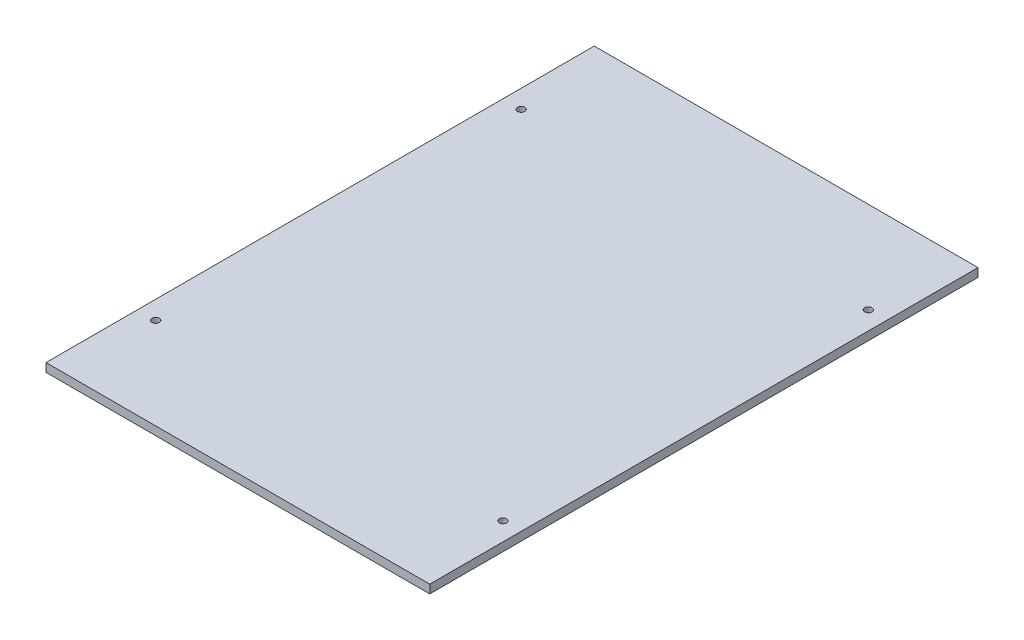
ISO-10303-21;
HEADER;
FILE_DESCRIPTION(('STEP AP214'),'2;1');
FILE_NAME('part.step','',(''),(''),'','','');
FILE_SCHEMA(('AUTOMOTIVE_DESIGN { 1 0 10303 214 1 1 1 1 }'));
ENDSEC;
DATA;
#1=APPLICATION_CONTEXT('core data for automotive mechanical design processes');
#2=APPLICATION_PROTOCOL_DEFINITION('international standard','automotive_design',2000,#1);
#3=PRODUCT_CONTEXT('',#1,'mechanical');
#4=PRODUCT('Part','Part','',(#3));
#5=PRODUCT_RELATED_PRODUCT_CATEGORY('part','',(#4));
#6=PRODUCT_DEFINITION_FORMATION('','',#4);
#7=PRODUCT_DEFINITION_CONTEXT('part definition',#1,'design');
#8=PRODUCT_DEFINITION('design','',#6,#7);
#9=PRODUCT_DEFINITION_SHAPE('','',#8);
#10=(LENGTH_UNIT() NAMED_UNIT(*) SI_UNIT(.MILLI.,.METRE.));
#11=(NAMED_UNIT(*) PLANE_ANGLE_UNIT() SI_UNIT($,.RADIAN.));
#12=(NAMED_UNIT(*) SI_UNIT($,.STERADIAN.) SOLID_ANGLE_UNIT());
#13=UNCERTAINTY_MEASURE_WITH_UNIT(LENGTH_MEASURE(1.E-05),#10,'distance_accuracy_value','');
#14=(GEOMETRIC_REPRESENTATION_CONTEXT(3) GLOBAL_UNCERTAINTY_ASSIGNED_CONTEXT((#13)) GLOBAL_UNIT_ASSIGNED_CONTEXT((#10,
#11,#12)) REPRESENTATION_CONTEXT('',''));
#15=CARTESIAN_POINT('',(0.,0.,0.));
#16=DIRECTION('',(0.,0.,1.));
#17=DIRECTION('',(1.,0.,0.));
#18=AXIS2_PLACEMENT_3D('',#15,#16,#17);
#19=CARTESIAN_POINT('',(0.,4.65,0.));
#20=DIRECTION('',(1.,0.,0.));
#21=DIRECTION('',(0.,0.,-1.));
#22=AXIS2_PLACEMENT_3D('',#19,#20,#21);
#23=PLANE('',#22);
#24=DIRECTION('',(0.,0.,1.));
#25=VECTOR('',#24,1.);
#26=CARTESIAN_POINT('',(0.,0.,0.));
#27=LINE('',#26,#25);
#28=CARTESIAN_POINT('',(0.,0.,-300.));
#29=VERTEX_POINT('',#28);
#30=CARTESIAN_POINT('',(0.,0.,0.));
#31=VERTEX_POINT('',#30);
#32=EDGE_CURVE('E96',#29,#31,#27,.T.);
#33=ORIENTED_EDGE('',*,*,#32,.T.);
#34=DIRECTION('',(0.,-1.,0.));
#35=VECTOR('',#34,1.);
#36=CARTESIAN_POINT('',(0.,4.65,0.));
#37=LINE('',#36,#35);
#38=CARTESIAN_POINT('',(0.,4.65,0.));
#39=VERTEX_POINT('',#38);
#40=EDGE_CURVE('E11',#39,#31,#37,.T.);
#41=ORIENTED_EDGE('',*,*,#40,.F.);
#42=DIRECTION('',(0.,0.,1.));
#43=VECTOR('',#42,1.);
#44=CARTESIAN_POINT('',(0.,4.65,0.));
#45=LINE('',#44,#43);
#46=CARTESIAN_POINT('',(0.,4.65,-300.));
#47=VERTEX_POINT('',#46);
#48=EDGE_CURVE('E84',#47,#39,#45,.T.);
#49=ORIENTED_EDGE('',*,*,#48,.F.);
#50=DIRECTION('',(0.,-1.,0.));
#51=VECTOR('',#50,1.);
#52=CARTESIAN_POINT('',(0.,4.65,-300.));
#53=LINE('',#52,#51);
#54=EDGE_CURVE('E92',#47,#29,#53,.T.);
#55=ORIENTED_EDGE('',*,*,#54,.T.);
#56=EDGE_LOOP('',(#33,#41,#49,#55));
#57=FACE_BOUND('',#56,.T.);
#58=ADVANCED_FACE('F33',(#57),#23,.F.);
#59=CARTESIAN_POINT('',(0.,4.65,0.));
#60=DIRECTION('',(0.,0.,-1.));
#61=DIRECTION('',(-1.,0.,0.));
#62=AXIS2_PLACEMENT_3D('',#59,#60,#61);
#63=PLANE('',#62);
#64=DIRECTION('',(1.,0.,0.));
#65=VECTOR('',#64,1.);
#66=CARTESIAN_POINT('',(0.,0.,0.));
#67=LINE('',#66,#65);
#68=CARTESIAN_POINT('',(210.,0.,0.));
#69=VERTEX_POINT('',#68);
#70=EDGE_CURVE('E88',#31,#69,#67,.T.);
#71=ORIENTED_EDGE('',*,*,#70,.T.);
#72=DIRECTION('',(0.,-1.,0.));
#73=VECTOR('',#72,1.);
#74=CARTESIAN_POINT('',(210.,4.65,0.));
#75=LINE('',#74,#73);
#76=CARTESIAN_POINT('',(210.,4.65,0.));
#77=VERTEX_POINT('',#76);
#78=EDGE_CURVE('E41',#77,#69,#75,.T.);
#79=ORIENTED_EDGE('',*,*,#78,.F.);
#80=DIRECTION('',(1.,0.,0.));
#81=VECTOR('',#80,1.);
#82=CARTESIAN_POINT('',(0.,4.65,0.));
#83=LINE('',#82,#81);
#84=EDGE_CURVE('E79',#39,#77,#83,.T.);
#85=ORIENTED_EDGE('',*,*,#84,.F.);
#86=ORIENTED_EDGE('',*,*,#40,.T.);
#87=EDGE_LOOP('',(#71,#79,#85,#86));
#88=FACE_BOUND('',#87,.T.);
#89=ADVANCED_FACE('F87',(#88),#63,.F.);
#90=CARTESIAN_POINT('',(210.,4.65,0.));
#91=DIRECTION('',(-1.,0.,0.));
#92=DIRECTION('',(0.,0.,1.));
#93=AXIS2_PLACEMENT_3D('',#90,#91,#92);
#94=PLANE('',#93);
#95=DIRECTION('',(0.,0.,-1.));
#96=VECTOR('',#95,1.);
#97=CARTESIAN_POINT('',(210.,0.,0.));
#98=LINE('',#97,#96);
#99=CARTESIAN_POINT('',(210.,0.,-300.));
#100=VERTEX_POINT('',#99);
#101=EDGE_CURVE('E66',#69,#100,#98,.T.);
#102=ORIENTED_EDGE('',*,*,#101,.T.);
#103=DIRECTION('',(0.,-1.,0.));
#104=VECTOR('',#103,1.);
#105=CARTESIAN_POINT('',(210.,4.65,-300.));
#106=LINE('',#105,#104);
#107=CARTESIAN_POINT('',(210.,4.65,-300.));
#108=VERTEX_POINT('',#107);
#109=EDGE_CURVE('E89',#108,#100,#106,.T.);
#110=ORIENTED_EDGE('',*,*,#109,.F.);
#111=DIRECTION('',(0.,0.,-1.));
#112=VECTOR('',#111,1.);
#113=CARTESIAN_POINT('',(210.,4.65,0.));
#114=LINE('',#113,#112);
#115=EDGE_CURVE('E82',#77,#108,#114,.T.);
#116=ORIENTED_EDGE('',*,*,#115,.F.);
#117=ORIENTED_EDGE('',*,*,#78,.T.);
#118=EDGE_LOOP('',(#102,#110,#116,#117));
#119=FACE_BOUND('',#118,.T.);
#120=ADVANCED_FACE('F90',(#119),#94,.F.);
#121=CARTESIAN_POINT('',(0.,4.65,-300.));
#122=DIRECTION('',(0.,0.,1.));
#123=DIRECTION('',(1.,0.,0.));
#124=AXIS2_PLACEMENT_3D('',#121,#122,#123);
#125=PLANE('',#124);
#126=DIRECTION('',(-1.,0.,0.));
#127=VECTOR('',#126,1.);
#128=CARTESIAN_POINT('',(0.,0.,-300.));
#129=LINE('',#128,#127);
#130=EDGE_CURVE('E72',#100,#29,#129,.T.);
#131=ORIENTED_EDGE('',*,*,#130,.T.);
#132=ORIENTED_EDGE('',*,*,#54,.F.);
#133=DIRECTION('',(-1.,0.,0.));
#134=VECTOR('',#133,1.);
#135=CARTESIAN_POINT('',(0.,4.65,-300.));
#136=LINE('',#135,#134);
#137=EDGE_CURVE('E49',#108,#47,#136,.T.);
#138=ORIENTED_EDGE('',*,*,#137,.F.);
#139=ORIENTED_EDGE('',*,*,#109,.T.);
#140=EDGE_LOOP('',(#131,#132,#138,#139));
#141=FACE_BOUND('',#140,.T.);
#142=ADVANCED_FACE('F104',(#141),#125,.F.);
#143=CARTESIAN_POINT('',(0.,4.65,0.));
#144=DIRECTION('',(0.,-1.,0.));
#145=DIRECTION('',(0.,0.,-1.));
#146=AXIS2_PLACEMENT_3D('',#143,#144,#145);
#147=PLANE('',#146);
#148=CARTESIAN_POINT('',(10.,4.65,-250.));
#149=DIRECTION('',(0.,1.,0.));
#150=DIRECTION('',(0.,0.,1.));
#151=AXIS2_PLACEMENT_3D('',#148,#149,#150);
#152=CIRCLE('',#151,1.99999999999999);
#153=CARTESIAN_POINT('',(10.,4.65,-248.));
#154=VERTEX_POINT('',#153);
#155=EDGE_CURVE('E130',#154,#154,#152,.T.);
#156=ORIENTED_EDGE('',*,*,#155,.F.);
#157=EDGE_LOOP('',(#156));
#158=FACE_BOUND('',#157,.T.);
#159=CARTESIAN_POINT('',(10.,4.65,-50.));
#160=DIRECTION('',(0.,1.,0.));
#161=DIRECTION('',(0.,0.,1.));
#162=AXIS2_PLACEMENT_3D('',#159,#160,#161);
#163=CIRCLE('',#162,1.99999999999999);
#164=CARTESIAN_POINT('',(10.,4.65,-48.));
#165=VERTEX_POINT('',#164);
#166=EDGE_CURVE('E124',#165,#165,#163,.T.);
#167=ORIENTED_EDGE('',*,*,#166,.F.);
#168=EDGE_LOOP('',(#167));
#169=FACE_BOUND('',#168,.T.);
#170=CARTESIAN_POINT('',(200.,4.65,-250.));
#171=DIRECTION('',(0.,1.,0.));
#172=DIRECTION('',(0.,0.,1.));
#173=AXIS2_PLACEMENT_3D('',#170,#171,#172);
#174=CIRCLE('',#173,1.99999999999997);
#175=CARTESIAN_POINT('',(200.,4.65,-248.));
#176=VERTEX_POINT('',#175);
#177=EDGE_CURVE('E118',#176,#176,#174,.T.);
#178=ORIENTED_EDGE('',*,*,#177,.F.);
#179=EDGE_LOOP('',(#178));
#180=FACE_BOUND('',#179,.T.);
#181=CARTESIAN_POINT('',(200.,4.65,-50.));
#182=DIRECTION('',(0.,1.,0.));
#183=DIRECTION('',(0.,0.,1.));
#184=AXIS2_PLACEMENT_3D('',#181,#182,#183);
#185=CIRCLE('',#184,1.99999999999997);
#186=CARTESIAN_POINT('',(200.,4.65,-48.));
#187=VERTEX_POINT('',#186);
#188=EDGE_CURVE('E112',#187,#187,#185,.T.);
#189=ORIENTED_EDGE('',*,*,#188,.F.);
#190=EDGE_LOOP('',(#189));
#191=FACE_BOUND('',#190,.T.);
#192=ORIENTED_EDGE('',*,*,#48,.T.);
#193=ORIENTED_EDGE('',*,*,#84,.T.);
#194=ORIENTED_EDGE('',*,*,#115,.T.);
#195=ORIENTED_EDGE('',*,*,#137,.T.);
#196=EDGE_LOOP('',(#192,#193,#194,#195));
#197=FACE_BOUND('',#196,.T.);
#198=ADVANCED_FACE('F80',(#158,#169,#180,#191,#197),#147,.F.);
#199=CARTESIAN_POINT('',(0.,0.,0.));
#200=DIRECTION('',(0.,-1.,0.));
#201=DIRECTION('',(0.,0.,-1.));
#202=AXIS2_PLACEMENT_3D('',#199,#200,#201);
#203=PLANE('',#202);
#204=CARTESIAN_POINT('',(10.,0.,-250.));
#205=DIRECTION('',(0.,1.,0.));
#206=DIRECTION('',(0.,0.,1.));
#207=AXIS2_PLACEMENT_3D('',#204,#205,#206);
#208=CIRCLE('',#207,2.);
#209=CARTESIAN_POINT('',(10.,0.,-248.));
#210=VERTEX_POINT('',#209);
#211=EDGE_CURVE('E127',#210,#210,#208,.T.);
#212=ORIENTED_EDGE('',*,*,#211,.T.);
#213=EDGE_LOOP('',(#212));
#214=FACE_BOUND('',#213,.T.);
#215=CARTESIAN_POINT('',(10.,0.,-50.));
#216=DIRECTION('',(0.,1.,0.));
#217=DIRECTION('',(0.,0.,1.));
#218=AXIS2_PLACEMENT_3D('',#215,#216,#217);
#219=CIRCLE('',#218,2.);
#220=CARTESIAN_POINT('',(10.,0.,-48.));
#221=VERTEX_POINT('',#220);
#222=EDGE_CURVE('E121',#221,#221,#219,.T.);
#223=ORIENTED_EDGE('',*,*,#222,.T.);
#224=EDGE_LOOP('',(#223));
#225=FACE_BOUND('',#224,.T.);
#226=CARTESIAN_POINT('',(200.,0.,-250.));
#227=DIRECTION('',(0.,1.,0.));
#228=DIRECTION('',(0.,0.,1.));
#229=AXIS2_PLACEMENT_3D('',#226,#227,#228);
#230=CIRCLE('',#229,2.);
#231=CARTESIAN_POINT('',(200.,0.,-248.));
#232=VERTEX_POINT('',#231);
#233=EDGE_CURVE('E115',#232,#232,#230,.T.);
#234=ORIENTED_EDGE('',*,*,#233,.T.);
#235=EDGE_LOOP('',(#234));
#236=FACE_BOUND('',#235,.T.);
#237=CARTESIAN_POINT('',(200.,0.,-50.));
#238=DIRECTION('',(0.,1.,0.));
#239=DIRECTION('',(0.,0.,1.));
#240=AXIS2_PLACEMENT_3D('',#237,#238,#239);
#241=CIRCLE('',#240,2.);
#242=CARTESIAN_POINT('',(200.,0.,-48.));
#243=VERTEX_POINT('',#242);
#244=EDGE_CURVE('E99',#243,#243,#241,.T.);
#245=ORIENTED_EDGE('',*,*,#244,.T.);
#246=EDGE_LOOP('',(#245));
#247=FACE_BOUND('',#246,.T.);
#248=ORIENTED_EDGE('',*,*,#32,.F.);
#249=ORIENTED_EDGE('',*,*,#130,.F.);
#250=ORIENTED_EDGE('',*,*,#101,.F.);
#251=ORIENTED_EDGE('',*,*,#70,.F.);
#252=EDGE_LOOP('',(#248,#249,#250,#251));
#253=FACE_BOUND('',#252,.T.);
#254=ADVANCED_FACE('F107',(#214,#225,#236,#247,#253),#203,.T.);
#255=CARTESIAN_POINT('',(200.,4.65,-50.));
#256=DIRECTION('',(0.,1.,0.));
#257=DIRECTION('',(0.,0.,1.));
#258=AXIS2_PLACEMENT_3D('',#255,#256,#257);
#259=CYLINDRICAL_SURFACE('',#258,1.99999999999999);
#260=ORIENTED_EDGE('',*,*,#244,.F.);
#261=EDGE_LOOP('',(#260));
#262=FACE_BOUND('',#261,.T.);
#263=ORIENTED_EDGE('',*,*,#188,.T.);
#264=EDGE_LOOP('',(#263));
#265=FACE_BOUND('',#264,.T.);
#266=ADVANCED_FACE('F145',(#262,#265),#259,.F.);
#267=CARTESIAN_POINT('',(200.,4.65,-250.));
#268=DIRECTION('',(0.,1.,0.));
#269=DIRECTION('',(0.,0.,1.));
#270=AXIS2_PLACEMENT_3D('',#267,#268,#269);
#271=CYLINDRICAL_SURFACE('',#270,1.99999999999999);
#272=ORIENTED_EDGE('',*,*,#233,.F.);
#273=EDGE_LOOP('',(#272));
#274=FACE_BOUND('',#273,.T.);
#275=ORIENTED_EDGE('',*,*,#177,.T.);
#276=EDGE_LOOP('',(#275));
#277=FACE_BOUND('',#276,.T.);
#278=ADVANCED_FACE('F147',(#274,#277),#271,.F.);
#279=CARTESIAN_POINT('',(10.,4.65,-50.));
#280=DIRECTION('',(0.,1.,0.));
#281=DIRECTION('',(0.,0.,1.));
#282=AXIS2_PLACEMENT_3D('',#279,#280,#281);
#283=CYLINDRICAL_SURFACE('',#282,1.99999999999999);
#284=ORIENTED_EDGE('',*,*,#222,.F.);
#285=EDGE_LOOP('',(#284));
#286=FACE_BOUND('',#285,.T.);
#287=ORIENTED_EDGE('',*,*,#166,.T.);
#288=EDGE_LOOP('',(#287));
#289=FACE_BOUND('',#288,.T.);
#290=ADVANCED_FACE('F154',(#286,#289),#283,.F.);
#291=CARTESIAN_POINT('',(10.,4.65,-250.));
#292=DIRECTION('',(0.,1.,0.));
#293=DIRECTION('',(0.,0.,1.));
#294=AXIS2_PLACEMENT_3D('',#291,#292,#293);
#295=CYLINDRICAL_SURFACE('',#294,1.99999999999999);
#296=ORIENTED_EDGE('',*,*,#211,.F.);
#297=EDGE_LOOP('',(#296));
#298=FACE_BOUND('',#297,.T.);
#299=ORIENTED_EDGE('',*,*,#155,.T.);
#300=EDGE_LOOP('',(#299));
#301=FACE_BOUND('',#300,.T.);
#302=ADVANCED_FACE('F134',(#298,#301),#295,.F.);
#303=CLOSED_SHELL('',(#58,#89,#120,#142,#198,#254,#266,#278,#290,#302));
#304=MANIFOLD_SOLID_BREP('B2',#303);
#305=ADVANCED_BREP_SHAPE_REPRESENTATION('',(#18,#304),#14);
#306=SHAPE_DEFINITION_REPRESENTATION(#9,#305);
ENDSEC;
END-ISO-10303-21;
